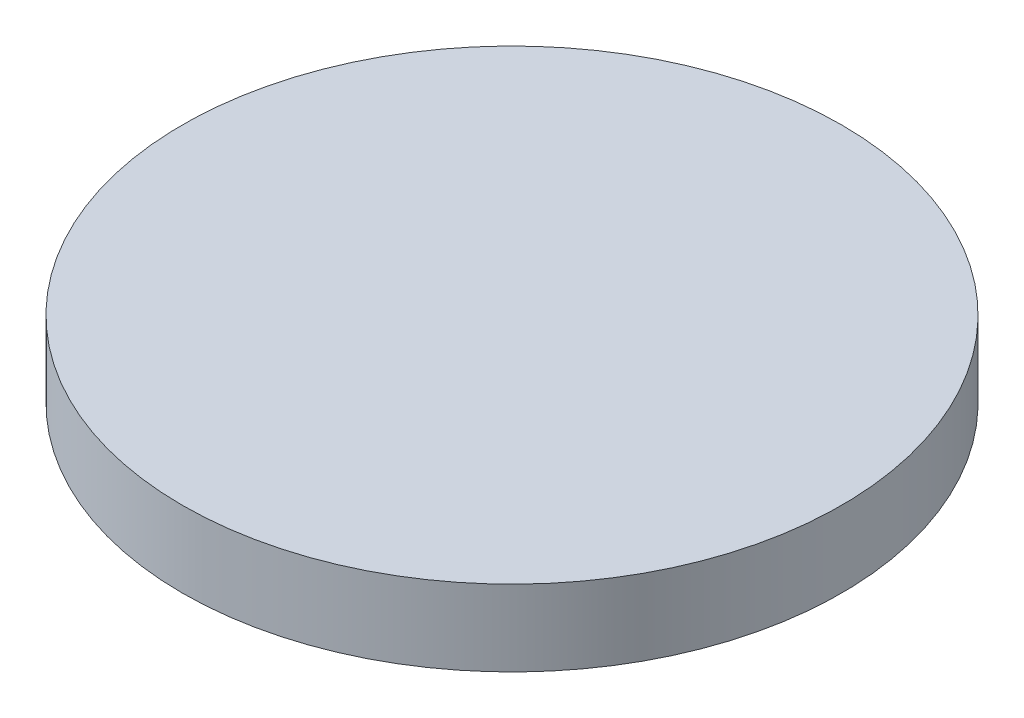
ISO-10303-21;
HEADER;
FILE_DESCRIPTION(('STEP AP214'),'2;1');
FILE_NAME('part.step','',(''),(''),'','','');
FILE_SCHEMA(('AUTOMOTIVE_DESIGN { 1 0 10303 214 1 1 1 1 }'));
ENDSEC;
DATA;
#1=APPLICATION_CONTEXT('core data for automotive mechanical design processes');
#2=APPLICATION_PROTOCOL_DEFINITION('international standard','automotive_design',2000,#1);
#3=PRODUCT_CONTEXT('',#1,'mechanical');
#4=PRODUCT('Part','Part','',(#3));
#5=PRODUCT_RELATED_PRODUCT_CATEGORY('part','',(#4));
#6=PRODUCT_DEFINITION_FORMATION('','',#4);
#7=PRODUCT_DEFINITION_CONTEXT('part definition',#1,'design');
#8=PRODUCT_DEFINITION('design','',#6,#7);
#9=PRODUCT_DEFINITION_SHAPE('','',#8);
#10=(LENGTH_UNIT() NAMED_UNIT(*) SI_UNIT(.MILLI.,.METRE.));
#11=(NAMED_UNIT(*) PLANE_ANGLE_UNIT() SI_UNIT($,.RADIAN.));
#12=(NAMED_UNIT(*) SI_UNIT($,.STERADIAN.) SOLID_ANGLE_UNIT());
#13=UNCERTAINTY_MEASURE_WITH_UNIT(LENGTH_MEASURE(1.E-05),#10,'distance_accuracy_value','');
#14=(GEOMETRIC_REPRESENTATION_CONTEXT(3) GLOBAL_UNCERTAINTY_ASSIGNED_CONTEXT((#13)) GLOBAL_UNIT_ASSIGNED_CONTEXT((#10,
#11,#12)) REPRESENTATION_CONTEXT('',''));
#15=CARTESIAN_POINT('',(0.,0.,0.));
#16=DIRECTION('',(0.,0.,1.));
#17=DIRECTION('',(1.,0.,0.));
#18=AXIS2_PLACEMENT_3D('',#15,#16,#17);
#19=CARTESIAN_POINT('',(0.,30.,0.));
#20=DIRECTION('',(0.,-1.,0.));
#21=DIRECTION('',(0.,0.,-1.));
#22=AXIS2_PLACEMENT_3D('',#19,#20,#21);
#23=CYLINDRICAL_SURFACE('',#22,130.);
#24=CARTESIAN_POINT('',(0.,30.,0.));
#25=DIRECTION('',(0.,1.,0.));
#26=DIRECTION('',(0.,0.,1.));
#27=AXIS2_PLACEMENT_3D('',#24,#25,#26);
#28=CIRCLE('',#27,130.);
#29=CARTESIAN_POINT('',(0.,30.,130.));
#30=VERTEX_POINT('',#29);
#31=EDGE_CURVE('E10',#30,#30,#28,.T.);
#32=ORIENTED_EDGE('',*,*,#31,.F.);
#33=EDGE_LOOP('',(#32));
#34=FACE_BOUND('',#33,.T.);
#35=CARTESIAN_POINT('',(0.,0.,0.));
#36=DIRECTION('',(0.,1.,0.));
#37=DIRECTION('',(0.,0.,1.));
#38=AXIS2_PLACEMENT_3D('',#35,#36,#37);
#39=CIRCLE('',#38,130.);
#40=CARTESIAN_POINT('',(0.,0.,130.));
#41=VERTEX_POINT('',#40);
#42=EDGE_CURVE('E46',#41,#41,#39,.T.);
#43=ORIENTED_EDGE('',*,*,#42,.T.);
#44=EDGE_LOOP('',(#43));
#45=FACE_BOUND('',#44,.T.);
#46=ADVANCED_FACE('F43',(#34,#45),#23,.T.);
#47=CARTESIAN_POINT('',(0.,30.,0.));
#48=DIRECTION('',(0.,1.,0.));
#49=DIRECTION('',(0.,0.,1.));
#50=AXIS2_PLACEMENT_3D('',#47,#48,#49);
#51=PLANE('',#50);
#52=ORIENTED_EDGE('',*,*,#31,.T.);
#53=EDGE_LOOP('',(#52));
#54=FACE_BOUND('',#53,.T.);
#55=ADVANCED_FACE('F60',(#54),#51,.T.);
#56=CARTESIAN_POINT('',(0.,0.,0.));
#57=DIRECTION('',(0.,1.,0.));
#58=DIRECTION('',(0.,0.,1.));
#59=AXIS2_PLACEMENT_3D('',#56,#57,#58);
#60=PLANE('',#59);
#61=ORIENTED_EDGE('',*,*,#42,.F.);
#62=EDGE_LOOP('',(#61));
#63=FACE_BOUND('',#62,.T.);
#64=ADVANCED_FACE('F58',(#63),#60,.F.);
#65=CLOSED_SHELL('',(#46,#55,#64));
#66=MANIFOLD_SOLID_BREP('B2',#65);
#67=ADVANCED_BREP_SHAPE_REPRESENTATION('',(#18,#66),#14);
#68=SHAPE_DEFINITION_REPRESENTATION(#9,#67);
ENDSEC;
END-ISO-10303-21;
